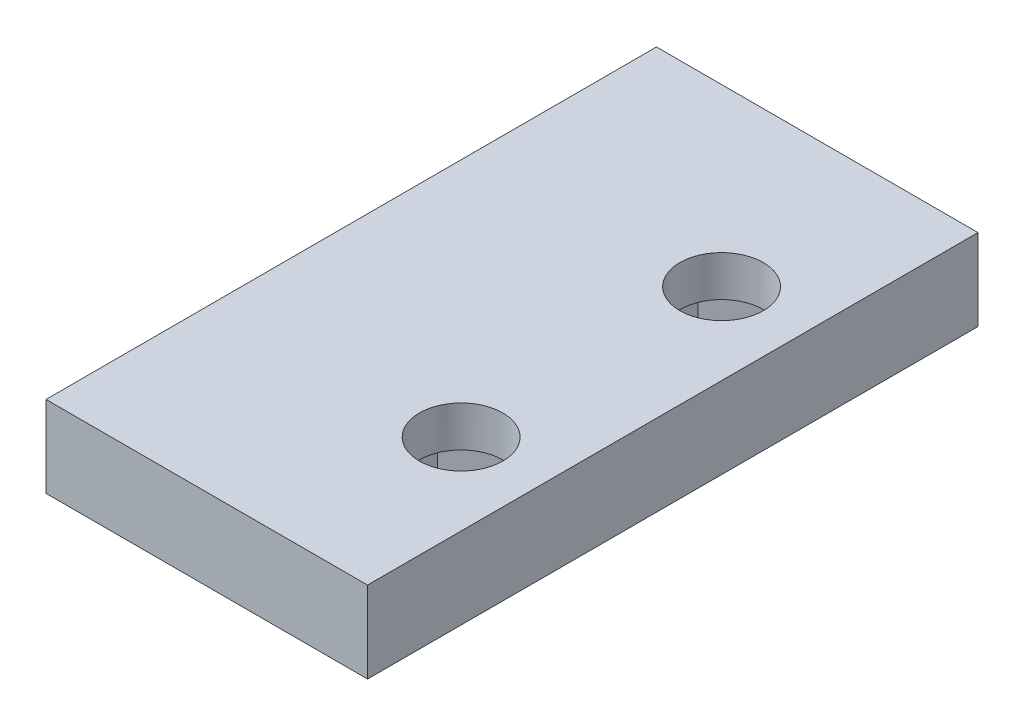
ISO-10303-21;
HEADER;
FILE_DESCRIPTION(('STEP AP214'),'2;1');
FILE_NAME('part.step','',(''),(''),'','','');
FILE_SCHEMA(('AUTOMOTIVE_DESIGN { 1 0 10303 214 1 1 1 1 }'));
ENDSEC;
DATA;
#1=APPLICATION_CONTEXT('core data for automotive mechanical design processes');
#2=APPLICATION_PROTOCOL_DEFINITION('international standard','automotive_design',2000,#1);
#3=PRODUCT_CONTEXT('',#1,'mechanical');
#4=PRODUCT('Part','Part','',(#3));
#5=PRODUCT_RELATED_PRODUCT_CATEGORY('part','',(#4));
#6=PRODUCT_DEFINITION_FORMATION('','',#4);
#7=PRODUCT_DEFINITION_CONTEXT('part definition',#1,'design');
#8=PRODUCT_DEFINITION('design','',#6,#7);
#9=PRODUCT_DEFINITION_SHAPE('','',#8);
#10=(LENGTH_UNIT() NAMED_UNIT(*) SI_UNIT(.MILLI.,.METRE.));
#11=(NAMED_UNIT(*) PLANE_ANGLE_UNIT() SI_UNIT($,.RADIAN.));
#12=(NAMED_UNIT(*) SI_UNIT($,.STERADIAN.) SOLID_ANGLE_UNIT());
#13=UNCERTAINTY_MEASURE_WITH_UNIT(LENGTH_MEASURE(1.E-05),#10,'distance_accuracy_value','');
#14=(GEOMETRIC_REPRESENTATION_CONTEXT(3) GLOBAL_UNCERTAINTY_ASSIGNED_CONTEXT((#13)) GLOBAL_UNIT_ASSIGNED_CONTEXT((#10,
#11,#12)) REPRESENTATION_CONTEXT('',''));
#15=CARTESIAN_POINT('',(0.,0.,0.));
#16=DIRECTION('',(0.,0.,1.));
#17=DIRECTION('',(1.,0.,0.));
#18=AXIS2_PLACEMENT_3D('',#15,#16,#17);
#19=CARTESIAN_POINT('',(11.8,0.,-8.6));
#20=DIRECTION('',(0.,1.,0.));
#21=DIRECTION('',(0.,0.,1.));
#22=AXIS2_PLACEMENT_3D('',#19,#20,#21);
#23=CYLINDRICAL_SURFACE('',#22,2.05);
#24=CARTESIAN_POINT('',(11.8,4.,-8.6));
#25=DIRECTION('',(0.,1.,0.));
#26=DIRECTION('',(0.,0.,1.));
#27=AXIS2_PLACEMENT_3D('',#24,#25,#26);
#28=CIRCLE('',#27,2.05);
#29=CARTESIAN_POINT('',(11.8,4.,-6.55));
#30=VERTEX_POINT('',#29);
#31=EDGE_CURVE('E260',#30,#30,#28,.T.);
#32=ORIENTED_EDGE('',*,*,#31,.T.);
#33=EDGE_LOOP('',(#32));
#34=FACE_BOUND('',#33,.T.);
#35=CARTESIAN_POINT('',(11.8,2.,-8.6));
#36=DIRECTION('',(0.,-1.,0.));
#37=DIRECTION('',(0.,0.,-1.));
#38=AXIS2_PLACEMENT_3D('',#35,#36,#37);
#39=CIRCLE('',#38,2.05);
#40=CARTESIAN_POINT('',(11.8,2.,-10.65));
#41=VERTEX_POINT('',#40);
#42=EDGE_CURVE('E43',#41,#41,#39,.F.);
#43=ORIENTED_EDGE('',*,*,#42,.F.);
#44=EDGE_LOOP('',(#43));
#45=FACE_BOUND('',#44,.T.);
#46=ADVANCED_FACE('F39',(#34,#45),#23,.F.);
#47=CARTESIAN_POINT('',(11.8,0.,-21.4));
#48=DIRECTION('',(0.,1.,0.));
#49=DIRECTION('',(0.,0.,1.));
#50=AXIS2_PLACEMENT_3D('',#47,#48,#49);
#51=CYLINDRICAL_SURFACE('',#50,2.05);
#52=CARTESIAN_POINT('',(11.8,4.,-21.4));
#53=DIRECTION('',(0.,1.,0.));
#54=DIRECTION('',(0.,0.,1.));
#55=AXIS2_PLACEMENT_3D('',#52,#53,#54);
#56=CIRCLE('',#55,2.05);
#57=CARTESIAN_POINT('',(11.8,4.,-19.35));
#58=VERTEX_POINT('',#57);
#59=EDGE_CURVE('E256',#58,#58,#56,.T.);
#60=ORIENTED_EDGE('',*,*,#59,.T.);
#61=EDGE_LOOP('',(#60));
#62=FACE_BOUND('',#61,.T.);
#63=CARTESIAN_POINT('',(11.8,2.,-21.4));
#64=DIRECTION('',(0.,-1.,0.));
#65=DIRECTION('',(0.,0.,-1.));
#66=AXIS2_PLACEMENT_3D('',#63,#64,#65);
#67=CIRCLE('',#66,2.05);
#68=CARTESIAN_POINT('',(11.8,2.,-23.45));
#69=VERTEX_POINT('',#68);
#70=EDGE_CURVE('E202',#69,#69,#67,.F.);
#71=ORIENTED_EDGE('',*,*,#70,.F.);
#72=EDGE_LOOP('',(#71));
#73=FACE_BOUND('',#72,.T.);
#74=ADVANCED_FACE('F294',(#62,#73),#51,.F.);
#75=CARTESIAN_POINT('',(0.,4.,0.));
#76=DIRECTION('',(1.,0.,0.));
#77=DIRECTION('',(0.,0.,-1.));
#78=AXIS2_PLACEMENT_3D('',#75,#76,#77);
#79=PLANE('',#78);
#80=DIRECTION('',(0.,0.,1.));
#81=VECTOR('',#80,1.);
#82=CARTESIAN_POINT('',(0.,0.,0.));
#83=LINE('',#82,#81);
#84=CARTESIAN_POINT('',(0.,0.,-30.));
#85=VERTEX_POINT('',#84);
#86=CARTESIAN_POINT('',(0.,0.,0.));
#87=VERTEX_POINT('',#86);
#88=EDGE_CURVE('E259',#85,#87,#83,.T.);
#89=ORIENTED_EDGE('',*,*,#88,.T.);
#90=DIRECTION('',(0.,-1.,0.));
#91=VECTOR('',#90,1.);
#92=CARTESIAN_POINT('',(0.,4.,0.));
#93=LINE('',#92,#91);
#94=CARTESIAN_POINT('',(0.,4.,0.));
#95=VERTEX_POINT('',#94);
#96=EDGE_CURVE('E11',#95,#87,#93,.T.);
#97=ORIENTED_EDGE('',*,*,#96,.F.);
#98=DIRECTION('',(0.,0.,1.));
#99=VECTOR('',#98,1.);
#100=CARTESIAN_POINT('',(0.,4.,0.));
#101=LINE('',#100,#99);
#102=CARTESIAN_POINT('',(0.,4.,-30.));
#103=VERTEX_POINT('',#102);
#104=EDGE_CURVE('E263',#103,#95,#101,.T.);
#105=ORIENTED_EDGE('',*,*,#104,.F.);
#106=DIRECTION('',(0.,-1.,0.));
#107=VECTOR('',#106,1.);
#108=CARTESIAN_POINT('',(0.,4.,-30.));
#109=LINE('',#108,#107);
#110=EDGE_CURVE('E273',#103,#85,#109,.T.);
#111=ORIENTED_EDGE('',*,*,#110,.T.);
#112=EDGE_LOOP('',(#89,#97,#105,#111));
#113=FACE_BOUND('',#112,.T.);
#114=ADVANCED_FACE('F41',(#113),#79,.F.);
#115=CARTESIAN_POINT('',(0.,4.,0.));
#116=DIRECTION('',(0.,0.,-1.));
#117=DIRECTION('',(-1.,0.,0.));
#118=AXIS2_PLACEMENT_3D('',#115,#116,#117);
#119=PLANE('',#118);
#120=DIRECTION('',(1.,0.,0.));
#121=VECTOR('',#120,1.);
#122=CARTESIAN_POINT('',(0.,0.,0.));
#123=LINE('',#122,#121);
#124=CARTESIAN_POINT('',(15.8,0.,0.));
#125=VERTEX_POINT('',#124);
#126=EDGE_CURVE('E276',#87,#125,#123,.T.);
#127=ORIENTED_EDGE('',*,*,#126,.T.);
#128=DIRECTION('',(0.,-1.,0.));
#129=VECTOR('',#128,1.);
#130=CARTESIAN_POINT('',(15.8,4.,0.));
#131=LINE('',#130,#129);
#132=CARTESIAN_POINT('',(15.8,4.,0.));
#133=VERTEX_POINT('',#132);
#134=EDGE_CURVE('E48',#133,#125,#131,.T.);
#135=ORIENTED_EDGE('',*,*,#134,.F.);
#136=DIRECTION('',(1.,0.,0.));
#137=VECTOR('',#136,1.);
#138=CARTESIAN_POINT('',(0.,4.,0.));
#139=LINE('',#138,#137);
#140=EDGE_CURVE('E266',#95,#133,#139,.T.);
#141=ORIENTED_EDGE('',*,*,#140,.F.);
#142=ORIENTED_EDGE('',*,*,#96,.T.);
#143=EDGE_LOOP('',(#127,#135,#141,#142));
#144=FACE_BOUND('',#143,.T.);
#145=ADVANCED_FACE('F319',(#144),#119,.F.);
#146=CARTESIAN_POINT('',(15.8,4.,0.));
#147=DIRECTION('',(-1.,0.,0.));
#148=DIRECTION('',(0.,0.,1.));
#149=AXIS2_PLACEMENT_3D('',#146,#147,#148);
#150=PLANE('',#149);
#151=DIRECTION('',(0.,0.,-1.));
#152=VECTOR('',#151,1.);
#153=CARTESIAN_POINT('',(15.8,0.,0.));
#154=LINE('',#153,#152);
#155=CARTESIAN_POINT('',(15.8,0.,-30.));
#156=VERTEX_POINT('',#155);
#157=EDGE_CURVE('E278',#125,#156,#154,.T.);
#158=ORIENTED_EDGE('',*,*,#157,.T.);
#159=DIRECTION('',(0.,-1.,0.));
#160=VECTOR('',#159,1.);
#161=CARTESIAN_POINT('',(15.8,4.,-30.));
#162=LINE('',#161,#160);
#163=CARTESIAN_POINT('',(15.8,4.,-30.));
#164=VERTEX_POINT('',#163);
#165=EDGE_CURVE('E283',#164,#156,#162,.T.);
#166=ORIENTED_EDGE('',*,*,#165,.F.);
#167=DIRECTION('',(0.,0.,-1.));
#168=VECTOR('',#167,1.);
#169=CARTESIAN_POINT('',(15.8,4.,0.));
#170=LINE('',#169,#168);
#171=EDGE_CURVE('E269',#133,#164,#170,.T.);
#172=ORIENTED_EDGE('',*,*,#171,.F.);
#173=ORIENTED_EDGE('',*,*,#134,.T.);
#174=EDGE_LOOP('',(#158,#166,#172,#173));
#175=FACE_BOUND('',#174,.T.);
#176=ADVANCED_FACE('F316',(#175),#150,.F.);
#177=CARTESIAN_POINT('',(0.,4.,-30.));
#178=DIRECTION('',(0.,0.,1.));
#179=DIRECTION('',(1.,0.,0.));
#180=AXIS2_PLACEMENT_3D('',#177,#178,#179);
#181=PLANE('',#180);
#182=DIRECTION('',(-1.,0.,0.));
#183=VECTOR('',#182,1.);
#184=CARTESIAN_POINT('',(0.,0.,-30.));
#185=LINE('',#184,#183);
#186=EDGE_CURVE('E267',#156,#85,#185,.T.);
#187=ORIENTED_EDGE('',*,*,#186,.T.);
#188=ORIENTED_EDGE('',*,*,#110,.F.);
#189=DIRECTION('',(-1.,0.,0.));
#190=VECTOR('',#189,1.);
#191=CARTESIAN_POINT('',(0.,4.,-30.));
#192=LINE('',#191,#190);
#193=EDGE_CURVE('E271',#164,#103,#192,.T.);
#194=ORIENTED_EDGE('',*,*,#193,.F.);
#195=ORIENTED_EDGE('',*,*,#165,.T.);
#196=EDGE_LOOP('',(#187,#188,#194,#195));
#197=FACE_BOUND('',#196,.T.);
#198=ADVANCED_FACE('F308',(#197),#181,.F.);
#199=CARTESIAN_POINT('',(0.,4.,0.));
#200=DIRECTION('',(0.,-1.,0.));
#201=DIRECTION('',(0.,0.,-1.));
#202=AXIS2_PLACEMENT_3D('',#199,#200,#201);
#203=PLANE('',#202);
#204=ORIENTED_EDGE('',*,*,#59,.F.);
#205=EDGE_LOOP('',(#204));
#206=FACE_BOUND('',#205,.T.);
#207=ORIENTED_EDGE('',*,*,#31,.F.);
#208=EDGE_LOOP('',(#207));
#209=FACE_BOUND('',#208,.T.);
#210=ORIENTED_EDGE('',*,*,#104,.T.);
#211=ORIENTED_EDGE('',*,*,#140,.T.);
#212=ORIENTED_EDGE('',*,*,#171,.T.);
#213=ORIENTED_EDGE('',*,*,#193,.T.);
#214=EDGE_LOOP('',(#210,#211,#212,#213));
#215=FACE_BOUND('',#214,.T.);
#216=ADVANCED_FACE('F304',(#206,#209,#215),#203,.F.);
#217=CARTESIAN_POINT('',(0.,0.,0.));
#218=DIRECTION('',(0.,-1.,0.));
#219=DIRECTION('',(0.,0.,-1.));
#220=AXIS2_PLACEMENT_3D('',#217,#218,#219);
#221=PLANE('',#220);
#222=DIRECTION('',(0.,0.,1.));
#223=VECTOR('',#222,1.);
#224=CARTESIAN_POINT('',(14.55,0.,-10.1877132402715));
#225=LINE('',#224,#223);
#226=CARTESIAN_POINT('',(14.55,0.,-10.1877132402715));
#227=VERTEX_POINT('',#226);
#228=CARTESIAN_POINT('',(14.55,0.,-7.01228675972853));
#229=VERTEX_POINT('',#228);
#230=EDGE_CURVE('E56',#227,#229,#225,.T.);
#231=ORIENTED_EDGE('',*,*,#230,.F.);
#232=DIRECTION('',(0.866025403784438,0.,0.500000000000001));
#233=VECTOR('',#232,1.);
#234=CARTESIAN_POINT('',(11.8,0.,-11.7754264805429));
#235=LINE('',#234,#233);
#236=CARTESIAN_POINT('',(11.8,0.,-11.7754264805429));
#237=VERTEX_POINT('',#236);
#238=EDGE_CURVE('E176',#237,#227,#235,.T.);
#239=ORIENTED_EDGE('',*,*,#238,.F.);
#240=DIRECTION('',(0.866025403784439,0.,-0.5));
#241=VECTOR('',#240,1.);
#242=CARTESIAN_POINT('',(9.05000000000001,0.,-10.1877132402715));
#243=LINE('',#242,#241);
#244=CARTESIAN_POINT('',(9.05000000000001,0.,-10.1877132402715));
#245=VERTEX_POINT('',#244);
#246=EDGE_CURVE('E179',#245,#237,#243,.T.);
#247=ORIENTED_EDGE('',*,*,#246,.F.);
#248=DIRECTION('',(0.,0.,-1.));
#249=VECTOR('',#248,1.);
#250=CARTESIAN_POINT('',(9.05000000000001,0.,-7.01228675972853));
#251=LINE('',#250,#249);
#252=CARTESIAN_POINT('',(9.05000000000001,0.,-7.01228675972853));
#253=VERTEX_POINT('',#252);
#254=EDGE_CURVE('E195',#253,#245,#251,.T.);
#255=ORIENTED_EDGE('',*,*,#254,.F.);
#256=DIRECTION('',(-0.866025403784439,0.,-0.5));
#257=VECTOR('',#256,1.);
#258=CARTESIAN_POINT('',(11.8,0.,-5.42457351945706));
#259=LINE('',#258,#257);
#260=CARTESIAN_POINT('',(11.8,0.,-5.42457351945706));
#261=VERTEX_POINT('',#260);
#262=EDGE_CURVE('E192',#261,#253,#259,.T.);
#263=ORIENTED_EDGE('',*,*,#262,.F.);
#264=DIRECTION('',(-0.866025403784439,0.,0.5));
#265=VECTOR('',#264,1.);
#266=CARTESIAN_POINT('',(14.55,0.,-7.01228675972853));
#267=LINE('',#266,#265);
#268=EDGE_CURVE('E190',#229,#261,#267,.T.);
#269=ORIENTED_EDGE('',*,*,#268,.F.);
#270=EDGE_LOOP('',(#231,#239,#247,#255,#263,#269));
#271=FACE_BOUND('',#270,.T.);
#272=DIRECTION('',(0.,0.,-1.));
#273=VECTOR('',#272,1.);
#274=CARTESIAN_POINT('',(9.05000000000001,0.,-19.8122867597285));
#275=LINE('',#274,#273);
#276=CARTESIAN_POINT('',(9.05000000000001,0.,-19.8122867597285));
#277=VERTEX_POINT('',#276);
#278=CARTESIAN_POINT('',(9.05,0.,-22.9877132402715));
#279=VERTEX_POINT('',#278);
#280=EDGE_CURVE('E64',#277,#279,#275,.T.);
#281=ORIENTED_EDGE('',*,*,#280,.F.);
#282=DIRECTION('',(-0.866025403784438,0.,-0.5));
#283=VECTOR('',#282,1.);
#284=CARTESIAN_POINT('',(11.8,0.,-18.2245735194571));
#285=LINE('',#284,#283);
#286=CARTESIAN_POINT('',(11.8,0.,-18.2245735194571));
#287=VERTEX_POINT('',#286);
#288=EDGE_CURVE('E223',#287,#277,#285,.T.);
#289=ORIENTED_EDGE('',*,*,#288,.F.);
#290=DIRECTION('',(-0.866025403784438,0.,0.500000000000001));
#291=VECTOR('',#290,1.);
#292=CARTESIAN_POINT('',(14.55,0.,-19.8122867597285));
#293=LINE('',#292,#291);
#294=CARTESIAN_POINT('',(14.55,0.,-19.8122867597285));
#295=VERTEX_POINT('',#294);
#296=EDGE_CURVE('E226',#295,#287,#293,.T.);
#297=ORIENTED_EDGE('',*,*,#296,.F.);
#298=DIRECTION('',(0.,0.,1.));
#299=VECTOR('',#298,1.);
#300=CARTESIAN_POINT('',(14.55,0.,-22.9877132402715));
#301=LINE('',#300,#299);
#302=CARTESIAN_POINT('',(14.55,0.,-22.9877132402715));
#303=VERTEX_POINT('',#302);
#304=EDGE_CURVE('E230',#303,#295,#301,.T.);
#305=ORIENTED_EDGE('',*,*,#304,.F.);
#306=DIRECTION('',(0.866025403784439,0.,0.499999999999999));
#307=VECTOR('',#306,1.);
#308=CARTESIAN_POINT('',(11.8,0.,-24.5754264805429));
#309=LINE('',#308,#307);
#310=CARTESIAN_POINT('',(11.8,0.,-24.5754264805429));
#311=VERTEX_POINT('',#310);
#312=EDGE_CURVE('E233',#311,#303,#309,.T.);
#313=ORIENTED_EDGE('',*,*,#312,.F.);
#314=DIRECTION('',(0.866025403784439,0.,-0.5));
#315=VECTOR('',#314,1.);
#316=CARTESIAN_POINT('',(9.05,0.,-22.9877132402715));
#317=LINE('',#316,#315);
#318=EDGE_CURVE('E236',#279,#311,#317,.T.);
#319=ORIENTED_EDGE('',*,*,#318,.F.);
#320=EDGE_LOOP('',(#281,#289,#297,#305,#313,#319));
#321=FACE_BOUND('',#320,.T.);
#322=ORIENTED_EDGE('',*,*,#88,.F.);
#323=ORIENTED_EDGE('',*,*,#186,.F.);
#324=ORIENTED_EDGE('',*,*,#157,.F.);
#325=ORIENTED_EDGE('',*,*,#126,.F.);
#326=EDGE_LOOP('',(#322,#323,#324,#325));
#327=FACE_BOUND('',#326,.T.);
#328=ADVANCED_FACE('F307',(#271,#321,#327),#221,.T.);
#329=CARTESIAN_POINT('',(0.,2.,0.));
#330=DIRECTION('',(0.,-1.,0.));
#331=DIRECTION('',(0.,0.,-1.));
#332=AXIS2_PLACEMENT_3D('',#329,#330,#331);
#333=PLANE('',#332);
#334=DIRECTION('',(0.,0.,-1.));
#335=VECTOR('',#334,1.);
#336=CARTESIAN_POINT('',(9.05000000000001,2.,-19.8122867597285));
#337=LINE('',#336,#335);
#338=CARTESIAN_POINT('',(9.05000000000001,2.,-19.8122867597285));
#339=VERTEX_POINT('',#338);
#340=CARTESIAN_POINT('',(9.05,2.,-22.9877132402715));
#341=VERTEX_POINT('',#340);
#342=EDGE_CURVE('E227',#339,#341,#337,.T.);
#343=ORIENTED_EDGE('',*,*,#342,.T.);
#344=DIRECTION('',(0.866025403784439,0.,-0.5));
#345=VECTOR('',#344,1.);
#346=CARTESIAN_POINT('',(9.05,2.,-22.9877132402715));
#347=LINE('',#346,#345);
#348=CARTESIAN_POINT('',(11.8,2.,-24.5754264805429));
#349=VERTEX_POINT('',#348);
#350=EDGE_CURVE('E251',#341,#349,#347,.T.);
#351=ORIENTED_EDGE('',*,*,#350,.T.);
#352=DIRECTION('',(0.866025403784439,0.,0.499999999999999));
#353=VECTOR('',#352,1.);
#354=CARTESIAN_POINT('',(11.8,2.,-24.5754264805429));
#355=LINE('',#354,#353);
#356=CARTESIAN_POINT('',(14.55,2.,-22.9877132402715));
#357=VERTEX_POINT('',#356);
#358=EDGE_CURVE('E248',#349,#357,#355,.T.);
#359=ORIENTED_EDGE('',*,*,#358,.T.);
#360=DIRECTION('',(0.,0.,1.));
#361=VECTOR('',#360,1.);
#362=CARTESIAN_POINT('',(14.55,2.,-22.9877132402715));
#363=LINE('',#362,#361);
#364=CARTESIAN_POINT('',(14.55,2.,-19.8122867597285));
#365=VERTEX_POINT('',#364);
#366=EDGE_CURVE('E245',#357,#365,#363,.T.);
#367=ORIENTED_EDGE('',*,*,#366,.T.);
#368=DIRECTION('',(-0.866025403784438,0.,0.500000000000001));
#369=VECTOR('',#368,1.);
#370=CARTESIAN_POINT('',(14.55,2.,-19.8122867597285));
#371=LINE('',#370,#369);
#372=CARTESIAN_POINT('',(11.8,2.,-18.2245735194571));
#373=VERTEX_POINT('',#372);
#374=EDGE_CURVE('E242',#365,#373,#371,.T.);
#375=ORIENTED_EDGE('',*,*,#374,.T.);
#376=DIRECTION('',(-0.866025403784438,0.,-0.5));
#377=VECTOR('',#376,1.);
#378=CARTESIAN_POINT('',(11.8,2.,-18.2245735194571));
#379=LINE('',#378,#377);
#380=EDGE_CURVE('E212',#373,#339,#379,.T.);
#381=ORIENTED_EDGE('',*,*,#380,.T.);
#382=EDGE_LOOP('',(#343,#351,#359,#367,#375,#381));
#383=FACE_BOUND('',#382,.T.);
#384=ORIENTED_EDGE('',*,*,#70,.T.);
#385=EDGE_LOOP('',(#384));
#386=FACE_BOUND('',#385,.T.);
#387=ADVANCED_FACE('F312',(#383,#386),#333,.T.);
#388=CARTESIAN_POINT('',(9.05000000000001,2.,-19.8122867597285));
#389=DIRECTION('',(-1.,0.,0.));
#390=DIRECTION('',(0.,0.,1.));
#391=AXIS2_PLACEMENT_3D('',#388,#389,#390);
#392=PLANE('',#391);
#393=ORIENTED_EDGE('',*,*,#280,.T.);
#394=DIRECTION('',(0.,-1.,0.));
#395=VECTOR('',#394,1.);
#396=CARTESIAN_POINT('',(9.05,2.,-22.9877132402715));
#397=LINE('',#396,#395);
#398=EDGE_CURVE('E210',#341,#279,#397,.T.);
#399=ORIENTED_EDGE('',*,*,#398,.F.);
#400=ORIENTED_EDGE('',*,*,#342,.F.);
#401=DIRECTION('',(0.,-1.,0.));
#402=VECTOR('',#401,1.);
#403=CARTESIAN_POINT('',(9.05000000000001,2.,-19.8122867597285));
#404=LINE('',#403,#402);
#405=EDGE_CURVE('E221',#339,#277,#404,.T.);
#406=ORIENTED_EDGE('',*,*,#405,.T.);
#407=EDGE_LOOP('',(#393,#399,#400,#406));
#408=FACE_BOUND('',#407,.T.);
#409=ADVANCED_FACE('F365',(#408),#392,.F.);
#410=CARTESIAN_POINT('',(11.8,2.,-18.2245735194571));
#411=DIRECTION('',(-0.5,0.,0.866025403784439));
#412=DIRECTION('',(0.866025403784438,0.,0.5));
#413=AXIS2_PLACEMENT_3D('',#410,#411,#412);
#414=PLANE('',#413);
#415=ORIENTED_EDGE('',*,*,#288,.T.);
#416=ORIENTED_EDGE('',*,*,#405,.F.);
#417=ORIENTED_EDGE('',*,*,#380,.F.);
#418=DIRECTION('',(0.,-1.,0.));
#419=VECTOR('',#418,1.);
#420=CARTESIAN_POINT('',(11.8,2.,-18.2245735194571));
#421=LINE('',#420,#419);
#422=EDGE_CURVE('E219',#373,#287,#421,.T.);
#423=ORIENTED_EDGE('',*,*,#422,.T.);
#424=EDGE_LOOP('',(#415,#416,#417,#423));
#425=FACE_BOUND('',#424,.T.);
#426=ADVANCED_FACE('F376',(#425),#414,.F.);
#427=CARTESIAN_POINT('',(14.55,2.,-19.8122867597285));
#428=DIRECTION('',(0.500000000000001,0.,0.866025403784438));
#429=DIRECTION('',(0.866025403784438,0.,-0.500000000000001));
#430=AXIS2_PLACEMENT_3D('',#427,#428,#429);
#431=PLANE('',#430);
#432=ORIENTED_EDGE('',*,*,#296,.T.);
#433=ORIENTED_EDGE('',*,*,#422,.F.);
#434=ORIENTED_EDGE('',*,*,#374,.F.);
#435=DIRECTION('',(0.,-1.,0.));
#436=VECTOR('',#435,1.);
#437=CARTESIAN_POINT('',(14.55,2.,-19.8122867597285));
#438=LINE('',#437,#436);
#439=EDGE_CURVE('E217',#365,#295,#438,.T.);
#440=ORIENTED_EDGE('',*,*,#439,.T.);
#441=EDGE_LOOP('',(#432,#433,#434,#440));
#442=FACE_BOUND('',#441,.T.);
#443=ADVANCED_FACE('F386',(#442),#431,.F.);
#444=CARTESIAN_POINT('',(14.55,2.,-22.9877132402715));
#445=DIRECTION('',(1.,0.,0.));
#446=DIRECTION('',(0.,0.,-1.));
#447=AXIS2_PLACEMENT_3D('',#444,#445,#446);
#448=PLANE('',#447);
#449=ORIENTED_EDGE('',*,*,#304,.T.);
#450=ORIENTED_EDGE('',*,*,#439,.F.);
#451=ORIENTED_EDGE('',*,*,#366,.F.);
#452=DIRECTION('',(0.,-1.,0.));
#453=VECTOR('',#452,1.);
#454=CARTESIAN_POINT('',(14.55,2.,-22.9877132402715));
#455=LINE('',#454,#453);
#456=EDGE_CURVE('E215',#357,#303,#455,.T.);
#457=ORIENTED_EDGE('',*,*,#456,.T.);
#458=EDGE_LOOP('',(#449,#450,#451,#457));
#459=FACE_BOUND('',#458,.T.);
#460=ADVANCED_FACE('F397',(#459),#448,.F.);
#461=CARTESIAN_POINT('',(11.8,2.,-24.5754264805429));
#462=DIRECTION('',(0.499999999999999,0.,-0.866025403784439));
#463=DIRECTION('',(-0.866025403784439,0.,-0.5));
#464=AXIS2_PLACEMENT_3D('',#461,#462,#463);
#465=PLANE('',#464);
#466=ORIENTED_EDGE('',*,*,#312,.T.);
#467=ORIENTED_EDGE('',*,*,#456,.F.);
#468=ORIENTED_EDGE('',*,*,#358,.F.);
#469=DIRECTION('',(0.,-1.,0.));
#470=VECTOR('',#469,1.);
#471=CARTESIAN_POINT('',(11.8,2.,-24.5754264805429));
#472=LINE('',#471,#470);
#473=EDGE_CURVE('E213',#349,#311,#472,.T.);
#474=ORIENTED_EDGE('',*,*,#473,.T.);
#475=EDGE_LOOP('',(#466,#467,#468,#474));
#476=FACE_BOUND('',#475,.T.);
#477=ADVANCED_FACE('F408',(#476),#465,.F.);
#478=CARTESIAN_POINT('',(9.05,2.,-22.9877132402715));
#479=DIRECTION('',(-0.5,0.,-0.866025403784439));
#480=DIRECTION('',(-0.866025403784439,0.,0.5));
#481=AXIS2_PLACEMENT_3D('',#478,#479,#480);
#482=PLANE('',#481);
#483=ORIENTED_EDGE('',*,*,#318,.T.);
#484=ORIENTED_EDGE('',*,*,#473,.F.);
#485=ORIENTED_EDGE('',*,*,#350,.F.);
#486=ORIENTED_EDGE('',*,*,#398,.T.);
#487=EDGE_LOOP('',(#483,#484,#485,#486));
#488=FACE_BOUND('',#487,.T.);
#489=ADVANCED_FACE('F419',(#488),#482,.F.);
#490=CARTESIAN_POINT('',(0.,2.,0.));
#491=DIRECTION('',(0.,-1.,0.));
#492=DIRECTION('',(0.,0.,-1.));
#493=AXIS2_PLACEMENT_3D('',#490,#491,#492);
#494=PLANE('',#493);
#495=DIRECTION('',(0.,0.,1.));
#496=VECTOR('',#495,1.);
#497=CARTESIAN_POINT('',(14.55,2.,-10.1877132402715));
#498=LINE('',#497,#496);
#499=CARTESIAN_POINT('',(14.55,2.,-10.1877132402715));
#500=VERTEX_POINT('',#499);
#501=CARTESIAN_POINT('',(14.55,2.,-7.01228675972853));
#502=VERTEX_POINT('',#501);
#503=EDGE_CURVE('E156',#500,#502,#498,.T.);
#504=ORIENTED_EDGE('',*,*,#503,.T.);
#505=DIRECTION('',(-0.866025403784439,0.,0.5));
#506=VECTOR('',#505,1.);
#507=CARTESIAN_POINT('',(14.55,2.,-7.01228675972853));
#508=LINE('',#507,#506);
#509=CARTESIAN_POINT('',(11.8,2.,-5.42457351945706));
#510=VERTEX_POINT('',#509);
#511=EDGE_CURVE('E165',#502,#510,#508,.T.);
#512=ORIENTED_EDGE('',*,*,#511,.T.);
#513=DIRECTION('',(-0.866025403784439,0.,-0.5));
#514=VECTOR('',#513,1.);
#515=CARTESIAN_POINT('',(11.8,2.,-5.42457351945706));
#516=LINE('',#515,#514);
#517=CARTESIAN_POINT('',(9.05000000000001,2.,-7.01228675972853));
#518=VERTEX_POINT('',#517);
#519=EDGE_CURVE('E170',#510,#518,#516,.T.);
#520=ORIENTED_EDGE('',*,*,#519,.T.);
#521=DIRECTION('',(0.,0.,-1.));
#522=VECTOR('',#521,1.);
#523=CARTESIAN_POINT('',(9.05000000000001,2.,-7.01228675972853));
#524=LINE('',#523,#522);
#525=CARTESIAN_POINT('',(9.05000000000001,2.,-10.1877132402715));
#526=VERTEX_POINT('',#525);
#527=EDGE_CURVE('E183',#518,#526,#524,.T.);
#528=ORIENTED_EDGE('',*,*,#527,.T.);
#529=DIRECTION('',(0.866025403784439,0.,-0.5));
#530=VECTOR('',#529,1.);
#531=CARTESIAN_POINT('',(9.05000000000001,2.,-10.1877132402715));
#532=LINE('',#531,#530);
#533=CARTESIAN_POINT('',(11.8,2.,-11.7754264805429));
#534=VERTEX_POINT('',#533);
#535=EDGE_CURVE('E186',#526,#534,#532,.T.);
#536=ORIENTED_EDGE('',*,*,#535,.T.);
#537=DIRECTION('',(0.866025403784438,0.,0.500000000000001));
#538=VECTOR('',#537,1.);
#539=CARTESIAN_POINT('',(11.8,2.,-11.7754264805429));
#540=LINE('',#539,#538);
#541=EDGE_CURVE('E162',#534,#500,#540,.T.);
#542=ORIENTED_EDGE('',*,*,#541,.T.);
#543=EDGE_LOOP('',(#504,#512,#520,#528,#536,#542));
#544=FACE_BOUND('',#543,.T.);
#545=ORIENTED_EDGE('',*,*,#42,.T.);
#546=EDGE_LOOP('',(#545));
#547=FACE_BOUND('',#546,.T.);
#548=ADVANCED_FACE('F172',(#544,#547),#494,.T.);
#549=CARTESIAN_POINT('',(14.55,2.,-10.1877132402715));
#550=DIRECTION('',(1.,0.,0.));
#551=DIRECTION('',(0.,0.,-1.));
#552=AXIS2_PLACEMENT_3D('',#549,#550,#551);
#553=PLANE('',#552);
#554=ORIENTED_EDGE('',*,*,#230,.T.);
#555=DIRECTION('',(0.,-1.,0.));
#556=VECTOR('',#555,1.);
#557=CARTESIAN_POINT('',(14.55,2.,-7.01228675972853));
#558=LINE('',#557,#556);
#559=EDGE_CURVE('E152',#502,#229,#558,.T.);
#560=ORIENTED_EDGE('',*,*,#559,.F.);
#561=ORIENTED_EDGE('',*,*,#503,.F.);
#562=DIRECTION('',(0.,-1.,0.));
#563=VECTOR('',#562,1.);
#564=CARTESIAN_POINT('',(14.55,2.,-10.1877132402715));
#565=LINE('',#564,#563);
#566=EDGE_CURVE('E200',#500,#227,#565,.T.);
#567=ORIENTED_EDGE('',*,*,#566,.T.);
#568=EDGE_LOOP('',(#554,#560,#561,#567));
#569=FACE_BOUND('',#568,.T.);
#570=ADVANCED_FACE('F154',(#569),#553,.F.);
#571=CARTESIAN_POINT('',(11.8,2.,-11.7754264805429));
#572=DIRECTION('',(0.500000000000001,0.,-0.866025403784438));
#573=DIRECTION('',(-0.866025403784438,0.,-0.500000000000001));
#574=AXIS2_PLACEMENT_3D('',#571,#572,#573);
#575=PLANE('',#574);
#576=ORIENTED_EDGE('',*,*,#238,.T.);
#577=ORIENTED_EDGE('',*,*,#566,.F.);
#578=ORIENTED_EDGE('',*,*,#541,.F.);
#579=DIRECTION('',(0.,-1.,0.));
#580=VECTOR('',#579,1.);
#581=CARTESIAN_POINT('',(11.8,2.,-11.7754264805429));
#582=LINE('',#581,#580);
#583=EDGE_CURVE('E203',#534,#237,#582,.T.);
#584=ORIENTED_EDGE('',*,*,#583,.T.);
#585=EDGE_LOOP('',(#576,#577,#578,#584));
#586=FACE_BOUND('',#585,.T.);
#587=ADVANCED_FACE('F449',(#586),#575,.F.);
#588=CARTESIAN_POINT('',(9.05000000000001,2.,-10.1877132402715));
#589=DIRECTION('',(-0.5,0.,-0.866025403784439));
#590=DIRECTION('',(-0.866025403784439,0.,0.5));
#591=AXIS2_PLACEMENT_3D('',#588,#589,#590);
#592=PLANE('',#591);
#593=ORIENTED_EDGE('',*,*,#246,.T.);
#594=ORIENTED_EDGE('',*,*,#583,.F.);
#595=ORIENTED_EDGE('',*,*,#535,.F.);
#596=DIRECTION('',(0.,-1.,0.));
#597=VECTOR('',#596,1.);
#598=CARTESIAN_POINT('',(9.05000000000001,2.,-10.1877132402715));
#599=LINE('',#598,#597);
#600=EDGE_CURVE('E205',#526,#245,#599,.T.);
#601=ORIENTED_EDGE('',*,*,#600,.T.);
#602=EDGE_LOOP('',(#593,#594,#595,#601));
#603=FACE_BOUND('',#602,.T.);
#604=ADVANCED_FACE('F459',(#603),#592,.F.);
#605=CARTESIAN_POINT('',(9.05000000000001,2.,-7.01228675972853));
#606=DIRECTION('',(-1.,0.,0.));
#607=DIRECTION('',(0.,0.,1.));
#608=AXIS2_PLACEMENT_3D('',#605,#606,#607);
#609=PLANE('',#608);
#610=ORIENTED_EDGE('',*,*,#254,.T.);
#611=ORIENTED_EDGE('',*,*,#600,.F.);
#612=ORIENTED_EDGE('',*,*,#527,.F.);
#613=DIRECTION('',(0.,-1.,0.));
#614=VECTOR('',#613,1.);
#615=CARTESIAN_POINT('',(9.05000000000001,2.,-7.01228675972853));
#616=LINE('',#615,#614);
#617=EDGE_CURVE('E207',#518,#253,#616,.T.);
#618=ORIENTED_EDGE('',*,*,#617,.T.);
#619=EDGE_LOOP('',(#610,#611,#612,#618));
#620=FACE_BOUND('',#619,.T.);
#621=ADVANCED_FACE('F470',(#620),#609,.F.);
#622=CARTESIAN_POINT('',(11.8,2.,-5.42457351945706));
#623=DIRECTION('',(-0.5,0.,0.866025403784439));
#624=DIRECTION('',(0.866025403784439,0.,0.5));
#625=AXIS2_PLACEMENT_3D('',#622,#623,#624);
#626=PLANE('',#625);
#627=ORIENTED_EDGE('',*,*,#262,.T.);
#628=ORIENTED_EDGE('',*,*,#617,.F.);
#629=ORIENTED_EDGE('',*,*,#519,.F.);
#630=DIRECTION('',(0.,-1.,0.));
#631=VECTOR('',#630,1.);
#632=CARTESIAN_POINT('',(11.8,2.,-5.42457351945706));
#633=LINE('',#632,#631);
#634=EDGE_CURVE('E161',#510,#261,#633,.T.);
#635=ORIENTED_EDGE('',*,*,#634,.T.);
#636=EDGE_LOOP('',(#627,#628,#629,#635));
#637=FACE_BOUND('',#636,.T.);
#638=ADVANCED_FACE('F481',(#637),#626,.F.);
#639=CARTESIAN_POINT('',(14.55,2.,-7.01228675972853));
#640=DIRECTION('',(0.5,0.,0.866025403784439));
#641=DIRECTION('',(0.866025403784439,0.,-0.5));
#642=AXIS2_PLACEMENT_3D('',#639,#640,#641);
#643=PLANE('',#642);
#644=ORIENTED_EDGE('',*,*,#268,.T.);
#645=ORIENTED_EDGE('',*,*,#634,.F.);
#646=ORIENTED_EDGE('',*,*,#511,.F.);
#647=ORIENTED_EDGE('',*,*,#559,.T.);
#648=EDGE_LOOP('',(#644,#645,#646,#647));
#649=FACE_BOUND('',#648,.T.);
#650=ADVANCED_FACE('F166',(#649),#643,.F.);
#651=CLOSED_SHELL('',(#46,#74,#114,#145,#176,#198,#216,#328,#387,#409,#426,#443,#460,#477,#489,
#548,#570,#587,#604,#621,#638,#650));
#652=MANIFOLD_SOLID_BREP('B2',#651);
#653=ADVANCED_BREP_SHAPE_REPRESENTATION('',(#18,#652),#14);
#654=SHAPE_DEFINITION_REPRESENTATION(#9,#653);
ENDSEC;
END-ISO-10303-21;
